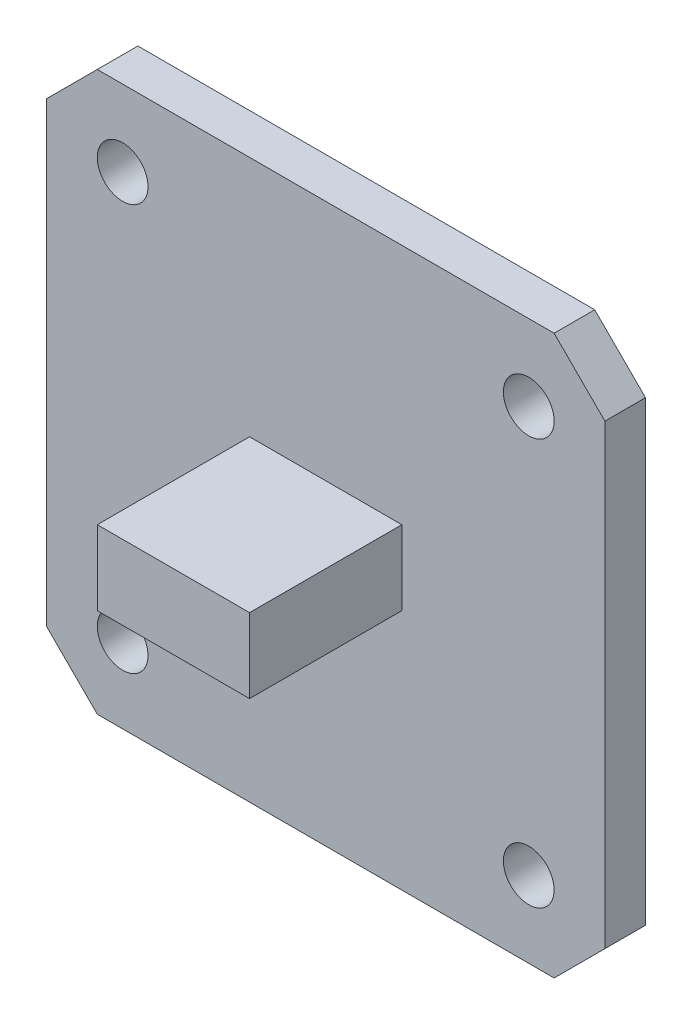
ISO-10303-21;
HEADER;
FILE_DESCRIPTION(('STEP AP214'),'2;1');
FILE_NAME('part.step','',(''),(''),'','','');
FILE_SCHEMA(('AUTOMOTIVE_DESIGN { 1 0 10303 214 1 1 1 1 }'));
ENDSEC;
DATA;
#1=APPLICATION_CONTEXT('core data for automotive mechanical design processes');
#2=APPLICATION_PROTOCOL_DEFINITION('international standard','automotive_design',2000,#1);
#3=PRODUCT_CONTEXT('',#1,'mechanical');
#4=PRODUCT('Part','Part','',(#3));
#5=PRODUCT_RELATED_PRODUCT_CATEGORY('part','',(#4));
#6=PRODUCT_DEFINITION_FORMATION('','',#4);
#7=PRODUCT_DEFINITION_CONTEXT('part definition',#1,'design');
#8=PRODUCT_DEFINITION('design','',#6,#7);
#9=PRODUCT_DEFINITION_SHAPE('','',#8);
#10=(LENGTH_UNIT() NAMED_UNIT(*) SI_UNIT(.MILLI.,.METRE.));
#11=(NAMED_UNIT(*) PLANE_ANGLE_UNIT() SI_UNIT($,.RADIAN.));
#12=(NAMED_UNIT(*) SI_UNIT($,.STERADIAN.) SOLID_ANGLE_UNIT());
#13=UNCERTAINTY_MEASURE_WITH_UNIT(LENGTH_MEASURE(1.E-05),#10,'distance_accuracy_value','');
#14=(GEOMETRIC_REPRESENTATION_CONTEXT(3) GLOBAL_UNCERTAINTY_ASSIGNED_CONTEXT((#13)) GLOBAL_UNIT_ASSIGNED_CONTEXT((#10,
#11,#12)) REPRESENTATION_CONTEXT('',''));
#15=CARTESIAN_POINT('',(0.,0.,0.));
#16=DIRECTION('',(0.,0.,1.));
#17=DIRECTION('',(1.,0.,0.));
#18=AXIS2_PLACEMENT_3D('',#15,#16,#17);
#19=CARTESIAN_POINT('',(0.,0.,2.4));
#20=DIRECTION('',(0.,0.,1.));
#21=DIRECTION('',(1.,0.,0.));
#22=AXIS2_PLACEMENT_3D('',#19,#20,#21);
#23=PLANE('',#22);
#24=CARTESIAN_POINT('',(4.49999999999999,4.5,2.4));
#25=DIRECTION('',(0.,0.,1.));
#26=DIRECTION('',(-1.,0.,0.));
#27=AXIS2_PLACEMENT_3D('',#24,#25,#26);
#28=CIRCLE('',#27,1.5);
#29=CARTESIAN_POINT('',(3.,4.5,2.4));
#30=VERTEX_POINT('',#29);
#31=EDGE_CURVE('E201',#30,#30,#28,.T.);
#32=ORIENTED_EDGE('',*,*,#31,.F.);
#33=EDGE_LOOP('',(#32));
#34=FACE_BOUND('',#33,.T.);
#35=CARTESIAN_POINT('',(4.5,28.5,2.4));
#36=DIRECTION('',(0.,0.,1.));
#37=DIRECTION('',(1.,0.,0.));
#38=AXIS2_PLACEMENT_3D('',#35,#36,#37);
#39=CIRCLE('',#38,1.5);
#40=CARTESIAN_POINT('',(6.,28.5,2.4));
#41=VERTEX_POINT('',#40);
#42=EDGE_CURVE('E146',#41,#41,#39,.T.);
#43=ORIENTED_EDGE('',*,*,#42,.F.);
#44=EDGE_LOOP('',(#43));
#45=FACE_BOUND('',#44,.T.);
#46=DIRECTION('',(-1.,0.,0.));
#47=VECTOR('',#46,1.);
#48=CARTESIAN_POINT('',(29.9999999999999,33.,2.4));
#49=LINE('',#48,#47);
#50=CARTESIAN_POINT('',(29.9999999999999,33.,2.4));
#51=VERTEX_POINT('',#50);
#52=CARTESIAN_POINT('',(3.,33.,2.4));
#53=VERTEX_POINT('',#52);
#54=EDGE_CURVE('E158',#51,#53,#49,.T.);
#55=ORIENTED_EDGE('',*,*,#54,.T.);
#56=DIRECTION('',(-0.707106781186547,-0.707106781186548,0.));
#57=VECTOR('',#56,1.);
#58=CARTESIAN_POINT('',(3.,33.,2.4));
#59=LINE('',#58,#57);
#60=CARTESIAN_POINT('',(0.,30.,2.4));
#61=VERTEX_POINT('',#60);
#62=EDGE_CURVE('E98',#53,#61,#59,.T.);
#63=ORIENTED_EDGE('',*,*,#62,.T.);
#64=DIRECTION('',(0.,-1.,0.));
#65=VECTOR('',#64,1.);
#66=CARTESIAN_POINT('',(0.,30.,2.4));
#67=LINE('',#66,#65);
#68=CARTESIAN_POINT('',(0.,3.00000000000001,2.4));
#69=VERTEX_POINT('',#68);
#70=EDGE_CURVE('E173',#61,#69,#67,.T.);
#71=ORIENTED_EDGE('',*,*,#70,.T.);
#72=DIRECTION('',(0.707106781186546,-0.707106781186549,0.));
#73=VECTOR('',#72,1.);
#74=CARTESIAN_POINT('',(0.,3.00000000000001,2.4));
#75=LINE('',#74,#73);
#76=CARTESIAN_POINT('',(3.,0.,2.4));
#77=VERTEX_POINT('',#76);
#78=EDGE_CURVE('E186',#69,#77,#75,.T.);
#79=ORIENTED_EDGE('',*,*,#78,.T.);
#80=DIRECTION('',(1.,0.,0.));
#81=VECTOR('',#80,1.);
#82=CARTESIAN_POINT('',(3.,0.,2.4));
#83=LINE('',#82,#81);
#84=CARTESIAN_POINT('',(30.,0.,2.4));
#85=VERTEX_POINT('',#84);
#86=EDGE_CURVE('E121',#77,#85,#83,.T.);
#87=ORIENTED_EDGE('',*,*,#86,.T.);
#88=DIRECTION('',(0.707106781186549,0.707106781186546,0.));
#89=VECTOR('',#88,1.);
#90=CARTESIAN_POINT('',(30.,0.,2.4));
#91=LINE('',#90,#89);
#92=CARTESIAN_POINT('',(33.,2.99999999999999,2.4));
#93=VERTEX_POINT('',#92);
#94=EDGE_CURVE('E114',#85,#93,#91,.T.);
#95=ORIENTED_EDGE('',*,*,#94,.T.);
#96=DIRECTION('',(0.,1.,0.));
#97=VECTOR('',#96,1.);
#98=CARTESIAN_POINT('',(33.,2.99999999999999,2.4));
#99=LINE('',#98,#97);
#100=CARTESIAN_POINT('',(33.,30.,2.4));
#101=VERTEX_POINT('',#100);
#102=EDGE_CURVE('E118',#93,#101,#99,.T.);
#103=ORIENTED_EDGE('',*,*,#102,.T.);
#104=DIRECTION('',(-0.707106781186561,0.707106781186534,0.));
#105=VECTOR('',#104,1.);
#106=CARTESIAN_POINT('',(33.,30.,2.4));
#107=LINE('',#106,#105);
#108=EDGE_CURVE('E57',#101,#51,#107,.T.);
#109=ORIENTED_EDGE('',*,*,#108,.T.);
#110=EDGE_LOOP('',(#55,#63,#71,#79,#87,#95,#103,#109));
#111=FACE_BOUND('',#110,.T.);
#112=CARTESIAN_POINT('',(28.4999999999999,28.5,2.4));
#113=DIRECTION('',(0.,0.,1.));
#114=DIRECTION('',(-1.,0.,0.));
#115=AXIS2_PLACEMENT_3D('',#112,#113,#114);
#116=CIRCLE('',#115,1.5);
#117=CARTESIAN_POINT('',(26.9999999999999,28.5,2.4));
#118=VERTEX_POINT('',#117);
#119=EDGE_CURVE('E195',#118,#118,#116,.T.);
#120=ORIENTED_EDGE('',*,*,#119,.F.);
#121=EDGE_LOOP('',(#120));
#122=FACE_BOUND('',#121,.T.);
#123=CARTESIAN_POINT('',(28.4999999999999,4.49999999999994,2.4));
#124=DIRECTION('',(0.,0.,1.));
#125=DIRECTION('',(1.,0.,0.));
#126=AXIS2_PLACEMENT_3D('',#123,#124,#125);
#127=CIRCLE('',#126,1.5);
#128=CARTESIAN_POINT('',(29.9999999999999,4.49999999999994,2.4));
#129=VERTEX_POINT('',#128);
#130=EDGE_CURVE('E207',#129,#129,#127,.T.);
#131=ORIENTED_EDGE('',*,*,#130,.F.);
#132=EDGE_LOOP('',(#131));
#133=FACE_BOUND('',#132,.T.);
#134=DIRECTION('',(1.,0.,0.));
#135=VECTOR('',#134,1.);
#136=CARTESIAN_POINT('',(11.9999999999999,14.3,2.4));
#137=LINE('',#136,#135);
#138=CARTESIAN_POINT('',(11.9999999999999,14.3,2.4));
#139=VERTEX_POINT('',#138);
#140=CARTESIAN_POINT('',(21.,14.3,2.4));
#141=VERTEX_POINT('',#140);
#142=EDGE_CURVE('E231',#139,#141,#137,.T.);
#143=ORIENTED_EDGE('',*,*,#142,.F.);
#144=DIRECTION('',(0.,-1.,0.));
#145=VECTOR('',#144,1.);
#146=CARTESIAN_POINT('',(11.9999999999999,18.7,2.4));
#147=LINE('',#146,#145);
#148=CARTESIAN_POINT('',(11.9999999999999,18.7,2.4));
#149=VERTEX_POINT('',#148);
#150=EDGE_CURVE('E234',#149,#139,#147,.T.);
#151=ORIENTED_EDGE('',*,*,#150,.F.);
#152=DIRECTION('',(-1.,0.,0.));
#153=VECTOR('',#152,1.);
#154=CARTESIAN_POINT('',(11.9999999999999,18.7,2.4));
#155=LINE('',#154,#153);
#156=CARTESIAN_POINT('',(21.,18.7,2.4));
#157=VERTEX_POINT('',#156);
#158=EDGE_CURVE('E226',#157,#149,#155,.T.);
#159=ORIENTED_EDGE('',*,*,#158,.F.);
#160=DIRECTION('',(0.,1.,0.));
#161=VECTOR('',#160,1.);
#162=CARTESIAN_POINT('',(21.,18.7,2.4));
#163=LINE('',#162,#161);
#164=EDGE_CURVE('E229',#141,#157,#163,.T.);
#165=ORIENTED_EDGE('',*,*,#164,.F.);
#166=EDGE_LOOP('',(#143,#151,#159,#165));
#167=FACE_BOUND('',#166,.T.);
#168=ADVANCED_FACE('F33',(#34,#45,#111,#122,#133,#167),#23,.T.);
#169=CARTESIAN_POINT('',(0.,0.,0.));
#170=DIRECTION('',(0.,0.,1.));
#171=DIRECTION('',(1.,0.,0.));
#172=AXIS2_PLACEMENT_3D('',#169,#170,#171);
#173=PLANE('',#172);
#174=DIRECTION('',(-1.,0.,0.));
#175=VECTOR('',#174,1.);
#176=CARTESIAN_POINT('',(29.9999999999999,33.,0.));
#177=LINE('',#176,#175);
#178=CARTESIAN_POINT('',(29.9999999999999,33.,0.));
#179=VERTEX_POINT('',#178);
#180=CARTESIAN_POINT('',(3.,33.,0.));
#181=VERTEX_POINT('',#180);
#182=EDGE_CURVE('E142',#179,#181,#177,.T.);
#183=ORIENTED_EDGE('',*,*,#182,.F.);
#184=DIRECTION('',(-0.707106781186561,0.707106781186534,0.));
#185=VECTOR('',#184,1.);
#186=CARTESIAN_POINT('',(33.,30.,0.));
#187=LINE('',#186,#185);
#188=CARTESIAN_POINT('',(33.,30.,0.));
#189=VERTEX_POINT('',#188);
#190=EDGE_CURVE('E90',#189,#179,#187,.T.);
#191=ORIENTED_EDGE('',*,*,#190,.F.);
#192=DIRECTION('',(0.,1.,0.));
#193=VECTOR('',#192,1.);
#194=CARTESIAN_POINT('',(33.,2.99999999999999,0.));
#195=LINE('',#194,#193);
#196=CARTESIAN_POINT('',(33.,2.99999999999999,0.));
#197=VERTEX_POINT('',#196);
#198=EDGE_CURVE('E155',#197,#189,#195,.T.);
#199=ORIENTED_EDGE('',*,*,#198,.F.);
#200=DIRECTION('',(0.707106781186549,0.707106781186546,0.));
#201=VECTOR('',#200,1.);
#202=CARTESIAN_POINT('',(30.,0.,0.));
#203=LINE('',#202,#201);
#204=CARTESIAN_POINT('',(30.,0.,0.));
#205=VERTEX_POINT('',#204);
#206=EDGE_CURVE('E130',#205,#197,#203,.T.);
#207=ORIENTED_EDGE('',*,*,#206,.F.);
#208=DIRECTION('',(1.,0.,0.));
#209=VECTOR('',#208,1.);
#210=CARTESIAN_POINT('',(3.,0.,0.));
#211=LINE('',#210,#209);
#212=CARTESIAN_POINT('',(3.,0.,0.));
#213=VERTEX_POINT('',#212);
#214=EDGE_CURVE('E152',#213,#205,#211,.T.);
#215=ORIENTED_EDGE('',*,*,#214,.F.);
#216=DIRECTION('',(0.707106781186546,-0.707106781186549,0.));
#217=VECTOR('',#216,1.);
#218=CARTESIAN_POINT('',(0.,3.00000000000001,0.));
#219=LINE('',#218,#217);
#220=CARTESIAN_POINT('',(0.,3.00000000000001,0.));
#221=VERTEX_POINT('',#220);
#222=EDGE_CURVE('E150',#221,#213,#219,.T.);
#223=ORIENTED_EDGE('',*,*,#222,.F.);
#224=DIRECTION('',(0.,-1.,0.));
#225=VECTOR('',#224,1.);
#226=CARTESIAN_POINT('',(0.,30.,0.));
#227=LINE('',#226,#225);
#228=CARTESIAN_POINT('',(0.,30.,0.));
#229=VERTEX_POINT('',#228);
#230=EDGE_CURVE('E148',#229,#221,#227,.T.);
#231=ORIENTED_EDGE('',*,*,#230,.F.);
#232=DIRECTION('',(-0.707106781186547,-0.707106781186548,0.));
#233=VECTOR('',#232,1.);
#234=CARTESIAN_POINT('',(3.,33.,0.));
#235=LINE('',#234,#233);
#236=EDGE_CURVE('E145',#181,#229,#235,.T.);
#237=ORIENTED_EDGE('',*,*,#236,.F.);
#238=EDGE_LOOP('',(#183,#191,#199,#207,#215,#223,#231,#237));
#239=FACE_BOUND('',#238,.T.);
#240=CARTESIAN_POINT('',(4.5,28.5,0.));
#241=DIRECTION('',(0.,0.,1.));
#242=DIRECTION('',(1.,0.,0.));
#243=AXIS2_PLACEMENT_3D('',#240,#241,#242);
#244=CIRCLE('',#243,1.5);
#245=CARTESIAN_POINT('',(6.,28.5,0.));
#246=VERTEX_POINT('',#245);
#247=EDGE_CURVE('E192',#246,#246,#244,.T.);
#248=ORIENTED_EDGE('',*,*,#247,.T.);
#249=EDGE_LOOP('',(#248));
#250=FACE_BOUND('',#249,.T.);
#251=CARTESIAN_POINT('',(28.4999999999999,28.5,0.));
#252=DIRECTION('',(0.,0.,1.));
#253=DIRECTION('',(-1.,0.,0.));
#254=AXIS2_PLACEMENT_3D('',#251,#252,#253);
#255=CIRCLE('',#254,1.5);
#256=CARTESIAN_POINT('',(26.9999999999999,28.5,0.));
#257=VERTEX_POINT('',#256);
#258=EDGE_CURVE('E198',#257,#257,#255,.T.);
#259=ORIENTED_EDGE('',*,*,#258,.T.);
#260=EDGE_LOOP('',(#259));
#261=FACE_BOUND('',#260,.T.);
#262=CARTESIAN_POINT('',(4.49999999999999,4.5,0.));
#263=DIRECTION('',(0.,0.,1.));
#264=DIRECTION('',(-1.,0.,0.));
#265=AXIS2_PLACEMENT_3D('',#262,#263,#264);
#266=CIRCLE('',#265,1.5);
#267=CARTESIAN_POINT('',(3.,4.5,0.));
#268=VERTEX_POINT('',#267);
#269=EDGE_CURVE('E204',#268,#268,#266,.T.);
#270=ORIENTED_EDGE('',*,*,#269,.T.);
#271=EDGE_LOOP('',(#270));
#272=FACE_BOUND('',#271,.T.);
#273=CARTESIAN_POINT('',(28.4999999999999,4.49999999999994,0.));
#274=DIRECTION('',(0.,0.,1.));
#275=DIRECTION('',(1.,0.,0.));
#276=AXIS2_PLACEMENT_3D('',#273,#274,#275);
#277=CIRCLE('',#276,1.5);
#278=CARTESIAN_POINT('',(29.9999999999999,4.49999999999994,0.));
#279=VERTEX_POINT('',#278);
#280=EDGE_CURVE('E210',#279,#279,#277,.T.);
#281=ORIENTED_EDGE('',*,*,#280,.T.);
#282=EDGE_LOOP('',(#281));
#283=FACE_BOUND('',#282,.T.);
#284=ADVANCED_FACE('F177',(#239,#250,#261,#272,#283),#173,.F.);
#285=CARTESIAN_POINT('',(29.9999999999999,33.,2.4));
#286=DIRECTION('',(0.,-1.,0.));
#287=DIRECTION('',(0.,0.,-1.));
#288=AXIS2_PLACEMENT_3D('',#285,#286,#287);
#289=PLANE('',#288);
#290=ORIENTED_EDGE('',*,*,#182,.T.);
#291=DIRECTION('',(0.,0.,-1.));
#292=VECTOR('',#291,1.);
#293=CARTESIAN_POINT('',(3.,33.,2.4));
#294=LINE('',#293,#292);
#295=EDGE_CURVE('E11',#53,#181,#294,.T.);
#296=ORIENTED_EDGE('',*,*,#295,.F.);
#297=ORIENTED_EDGE('',*,*,#54,.F.);
#298=DIRECTION('',(0.,0.,-1.));
#299=VECTOR('',#298,1.);
#300=CARTESIAN_POINT('',(29.9999999999999,33.,2.4));
#301=LINE('',#300,#299);
#302=EDGE_CURVE('E138',#51,#179,#301,.T.);
#303=ORIENTED_EDGE('',*,*,#302,.T.);
#304=EDGE_LOOP('',(#290,#296,#297,#303));
#305=FACE_BOUND('',#304,.T.);
#306=ADVANCED_FACE('F35',(#305),#289,.F.);
#307=CARTESIAN_POINT('',(3.,33.,2.4));
#308=DIRECTION('',(0.707106781186548,-0.707106781186547,0.));
#309=DIRECTION('',(0.707106781186547,0.707106781186548,0.));
#310=AXIS2_PLACEMENT_3D('',#307,#308,#309);
#311=PLANE('',#310);
#312=ORIENTED_EDGE('',*,*,#236,.T.);
#313=DIRECTION('',(0.,0.,-1.));
#314=VECTOR('',#313,1.);
#315=CARTESIAN_POINT('',(0.,30.,2.4));
#316=LINE('',#315,#314);
#317=EDGE_CURVE('E41',#61,#229,#316,.T.);
#318=ORIENTED_EDGE('',*,*,#317,.F.);
#319=ORIENTED_EDGE('',*,*,#62,.F.);
#320=ORIENTED_EDGE('',*,*,#295,.T.);
#321=EDGE_LOOP('',(#312,#318,#319,#320));
#322=FACE_BOUND('',#321,.T.);
#323=ADVANCED_FACE('F301',(#322),#311,.F.);
#324=CARTESIAN_POINT('',(0.,30.,2.4));
#325=DIRECTION('',(1.,0.,0.));
#326=DIRECTION('',(0.,1.,0.));
#327=AXIS2_PLACEMENT_3D('',#324,#325,#326);
#328=PLANE('',#327);
#329=ORIENTED_EDGE('',*,*,#230,.T.);
#330=DIRECTION('',(0.,0.,-1.));
#331=VECTOR('',#330,1.);
#332=CARTESIAN_POINT('',(0.,3.00000000000001,2.4));
#333=LINE('',#332,#331);
#334=EDGE_CURVE('E165',#69,#221,#333,.T.);
#335=ORIENTED_EDGE('',*,*,#334,.F.);
#336=ORIENTED_EDGE('',*,*,#70,.F.);
#337=ORIENTED_EDGE('',*,*,#317,.T.);
#338=EDGE_LOOP('',(#329,#335,#336,#337));
#339=FACE_BOUND('',#338,.T.);
#340=ADVANCED_FACE('F171',(#339),#328,.F.);
#341=CARTESIAN_POINT('',(0.,3.00000000000001,2.4));
#342=DIRECTION('',(0.707106781186549,0.707106781186546,0.));
#343=DIRECTION('',(-0.707106781186546,0.707106781186549,0.));
#344=AXIS2_PLACEMENT_3D('',#341,#342,#343);
#345=PLANE('',#344);
#346=ORIENTED_EDGE('',*,*,#222,.T.);
#347=DIRECTION('',(0.,0.,-1.));
#348=VECTOR('',#347,1.);
#349=CARTESIAN_POINT('',(3.,0.,2.4));
#350=LINE('',#349,#348);
#351=EDGE_CURVE('E162',#77,#213,#350,.T.);
#352=ORIENTED_EDGE('',*,*,#351,.F.);
#353=ORIENTED_EDGE('',*,*,#78,.F.);
#354=ORIENTED_EDGE('',*,*,#334,.T.);
#355=EDGE_LOOP('',(#346,#352,#353,#354));
#356=FACE_BOUND('',#355,.T.);
#357=ADVANCED_FACE('F182',(#356),#345,.F.);
#358=CARTESIAN_POINT('',(3.,0.,2.4));
#359=DIRECTION('',(0.,1.,0.));
#360=DIRECTION('',(0.,0.,1.));
#361=AXIS2_PLACEMENT_3D('',#358,#359,#360);
#362=PLANE('',#361);
#363=ORIENTED_EDGE('',*,*,#214,.T.);
#364=DIRECTION('',(0.,0.,-1.));
#365=VECTOR('',#364,1.);
#366=CARTESIAN_POINT('',(30.,0.,2.4));
#367=LINE('',#366,#365);
#368=EDGE_CURVE('E133',#85,#205,#367,.T.);
#369=ORIENTED_EDGE('',*,*,#368,.F.);
#370=ORIENTED_EDGE('',*,*,#86,.F.);
#371=ORIENTED_EDGE('',*,*,#351,.T.);
#372=EDGE_LOOP('',(#363,#369,#370,#371));
#373=FACE_BOUND('',#372,.T.);
#374=ADVANCED_FACE('F185',(#373),#362,.F.);
#375=CARTESIAN_POINT('',(30.,0.,2.4));
#376=DIRECTION('',(-0.707106781186546,0.707106781186549,0.));
#377=DIRECTION('',(-0.707106781186549,-0.707106781186546,0.));
#378=AXIS2_PLACEMENT_3D('',#375,#376,#377);
#379=PLANE('',#378);
#380=ORIENTED_EDGE('',*,*,#206,.T.);
#381=DIRECTION('',(0.,0.,-1.));
#382=VECTOR('',#381,1.);
#383=CARTESIAN_POINT('',(33.,2.99999999999999,2.4));
#384=LINE('',#383,#382);
#385=EDGE_CURVE('E127',#93,#197,#384,.T.);
#386=ORIENTED_EDGE('',*,*,#385,.F.);
#387=ORIENTED_EDGE('',*,*,#94,.F.);
#388=ORIENTED_EDGE('',*,*,#368,.T.);
#389=EDGE_LOOP('',(#380,#386,#387,#388));
#390=FACE_BOUND('',#389,.T.);
#391=ADVANCED_FACE('F128',(#390),#379,.F.);
#392=CARTESIAN_POINT('',(33.,2.99999999999999,2.4));
#393=DIRECTION('',(-1.,0.,0.));
#394=DIRECTION('',(0.,0.,1.));
#395=AXIS2_PLACEMENT_3D('',#392,#393,#394);
#396=PLANE('',#395);
#397=ORIENTED_EDGE('',*,*,#198,.T.);
#398=DIRECTION('',(0.,0.,-1.));
#399=VECTOR('',#398,1.);
#400=CARTESIAN_POINT('',(33.,30.,2.4));
#401=LINE('',#400,#399);
#402=EDGE_CURVE('E134',#101,#189,#401,.T.);
#403=ORIENTED_EDGE('',*,*,#402,.F.);
#404=ORIENTED_EDGE('',*,*,#102,.F.);
#405=ORIENTED_EDGE('',*,*,#385,.T.);
#406=EDGE_LOOP('',(#397,#403,#404,#405));
#407=FACE_BOUND('',#406,.T.);
#408=ADVANCED_FACE('F136',(#407),#396,.F.);
#409=CARTESIAN_POINT('',(33.,30.,2.4));
#410=DIRECTION('',(-0.707106781186534,-0.707106781186561,0.));
#411=DIRECTION('',(0.707106781186561,-0.707106781186534,0.));
#412=AXIS2_PLACEMENT_3D('',#409,#410,#411);
#413=PLANE('',#412);
#414=ORIENTED_EDGE('',*,*,#190,.T.);
#415=ORIENTED_EDGE('',*,*,#302,.F.);
#416=ORIENTED_EDGE('',*,*,#108,.F.);
#417=ORIENTED_EDGE('',*,*,#402,.T.);
#418=EDGE_LOOP('',(#414,#415,#416,#417));
#419=FACE_BOUND('',#418,.T.);
#420=ADVANCED_FACE('F289',(#419),#413,.F.);
#421=CARTESIAN_POINT('',(4.5,28.5,2.4));
#422=DIRECTION('',(0.,0.,-1.));
#423=DIRECTION('',(-1.,0.,0.));
#424=AXIS2_PLACEMENT_3D('',#421,#422,#423);
#425=CYLINDRICAL_SURFACE('',#424,1.5);
#426=ORIENTED_EDGE('',*,*,#42,.T.);
#427=EDGE_LOOP('',(#426));
#428=FACE_BOUND('',#427,.T.);
#429=ORIENTED_EDGE('',*,*,#247,.F.);
#430=EDGE_LOOP('',(#429));
#431=FACE_BOUND('',#430,.T.);
#432=ADVANCED_FACE('F286',(#428,#431),#425,.F.);
#433=CARTESIAN_POINT('',(28.4999999999999,28.5,2.4));
#434=DIRECTION('',(0.,0.,-1.));
#435=DIRECTION('',(-1.,0.,0.));
#436=AXIS2_PLACEMENT_3D('',#433,#434,#435);
#437=CYLINDRICAL_SURFACE('',#436,1.5);
#438=ORIENTED_EDGE('',*,*,#119,.T.);
#439=EDGE_LOOP('',(#438));
#440=FACE_BOUND('',#439,.T.);
#441=ORIENTED_EDGE('',*,*,#258,.F.);
#442=EDGE_LOOP('',(#441));
#443=FACE_BOUND('',#442,.T.);
#444=ADVANCED_FACE('F361',(#440,#443),#437,.F.);
#445=CARTESIAN_POINT('',(4.49999999999999,4.5,2.4));
#446=DIRECTION('',(0.,0.,-1.));
#447=DIRECTION('',(-1.,0.,0.));
#448=AXIS2_PLACEMENT_3D('',#445,#446,#447);
#449=CYLINDRICAL_SURFACE('',#448,1.5);
#450=ORIENTED_EDGE('',*,*,#31,.T.);
#451=EDGE_LOOP('',(#450));
#452=FACE_BOUND('',#451,.T.);
#453=ORIENTED_EDGE('',*,*,#269,.F.);
#454=EDGE_LOOP('',(#453));
#455=FACE_BOUND('',#454,.T.);
#456=ADVANCED_FACE('F369',(#452,#455),#449,.F.);
#457=CARTESIAN_POINT('',(28.4999999999999,4.49999999999994,2.4));
#458=DIRECTION('',(0.,0.,-1.));
#459=DIRECTION('',(-1.,0.,0.));
#460=AXIS2_PLACEMENT_3D('',#457,#458,#459);
#461=CYLINDRICAL_SURFACE('',#460,1.5);
#462=ORIENTED_EDGE('',*,*,#130,.T.);
#463=EDGE_LOOP('',(#462));
#464=FACE_BOUND('',#463,.T.);
#465=ORIENTED_EDGE('',*,*,#280,.F.);
#466=EDGE_LOOP('',(#465));
#467=FACE_BOUND('',#466,.T.);
#468=ADVANCED_FACE('F377',(#464,#467),#461,.F.);
#469=CARTESIAN_POINT('',(11.9999999999999,18.7,11.4));
#470=DIRECTION('',(1.,0.,0.));
#471=DIRECTION('',(0.,0.,-1.));
#472=AXIS2_PLACEMENT_3D('',#469,#470,#471);
#473=PLANE('',#472);
#474=ORIENTED_EDGE('',*,*,#150,.T.);
#475=DIRECTION('',(0.,0.,-1.));
#476=VECTOR('',#475,1.);
#477=CARTESIAN_POINT('',(11.9999999999999,14.3,11.4));
#478=LINE('',#477,#476);
#479=CARTESIAN_POINT('',(11.9999999999999,14.3,11.4));
#480=VERTEX_POINT('',#479);
#481=EDGE_CURVE('E213',#480,#139,#478,.T.);
#482=ORIENTED_EDGE('',*,*,#481,.F.);
#483=DIRECTION('',(0.,-1.,0.));
#484=VECTOR('',#483,1.);
#485=CARTESIAN_POINT('',(11.9999999999999,18.7,11.4));
#486=LINE('',#485,#484);
#487=CARTESIAN_POINT('',(11.9999999999999,18.7,11.4));
#488=VERTEX_POINT('',#487);
#489=EDGE_CURVE('E228',#488,#480,#486,.T.);
#490=ORIENTED_EDGE('',*,*,#489,.F.);
#491=DIRECTION('',(0.,0.,-1.));
#492=VECTOR('',#491,1.);
#493=CARTESIAN_POINT('',(11.9999999999999,18.7,11.4));
#494=LINE('',#493,#492);
#495=EDGE_CURVE('E222',#488,#149,#494,.T.);
#496=ORIENTED_EDGE('',*,*,#495,.T.);
#497=EDGE_LOOP('',(#474,#482,#490,#496));
#498=FACE_BOUND('',#497,.T.);
#499=ADVANCED_FACE('F257',(#498),#473,.F.);
#500=CARTESIAN_POINT('',(11.9999999999999,14.3,11.4));
#501=DIRECTION('',(0.,1.,0.));
#502=DIRECTION('',(-1.,0.,0.));
#503=AXIS2_PLACEMENT_3D('',#500,#501,#502);
#504=PLANE('',#503);
#505=ORIENTED_EDGE('',*,*,#142,.T.);
#506=DIRECTION('',(0.,0.,-1.));
#507=VECTOR('',#506,1.);
#508=CARTESIAN_POINT('',(21.,14.3,11.4));
#509=LINE('',#508,#507);
#510=CARTESIAN_POINT('',(21.,14.3,11.4));
#511=VERTEX_POINT('',#510);
#512=EDGE_CURVE('E218',#511,#141,#509,.T.);
#513=ORIENTED_EDGE('',*,*,#512,.F.);
#514=DIRECTION('',(1.,0.,0.));
#515=VECTOR('',#514,1.);
#516=CARTESIAN_POINT('',(11.9999999999999,14.3,11.4));
#517=LINE('',#516,#515);
#518=EDGE_CURVE('E242',#480,#511,#517,.T.);
#519=ORIENTED_EDGE('',*,*,#518,.F.);
#520=ORIENTED_EDGE('',*,*,#481,.T.);
#521=EDGE_LOOP('',(#505,#513,#519,#520));
#522=FACE_BOUND('',#521,.T.);
#523=ADVANCED_FACE('F262',(#522),#504,.F.);
#524=CARTESIAN_POINT('',(21.,18.7,11.4));
#525=DIRECTION('',(-1.,0.,0.));
#526=DIRECTION('',(0.,0.,1.));
#527=AXIS2_PLACEMENT_3D('',#524,#525,#526);
#528=PLANE('',#527);
#529=ORIENTED_EDGE('',*,*,#164,.T.);
#530=DIRECTION('',(0.,0.,-1.));
#531=VECTOR('',#530,1.);
#532=CARTESIAN_POINT('',(21.,18.7,11.4));
#533=LINE('',#532,#531);
#534=CARTESIAN_POINT('',(21.,18.7,11.4));
#535=VERTEX_POINT('',#534);
#536=EDGE_CURVE('E48',#535,#157,#533,.T.);
#537=ORIENTED_EDGE('',*,*,#536,.F.);
#538=DIRECTION('',(0.,1.,0.));
#539=VECTOR('',#538,1.);
#540=CARTESIAN_POINT('',(21.,18.7,11.4));
#541=LINE('',#540,#539);
#542=EDGE_CURVE('E239',#511,#535,#541,.T.);
#543=ORIENTED_EDGE('',*,*,#542,.F.);
#544=ORIENTED_EDGE('',*,*,#512,.T.);
#545=EDGE_LOOP('',(#529,#537,#543,#544));
#546=FACE_BOUND('',#545,.T.);
#547=ADVANCED_FACE('F271',(#546),#528,.F.);
#548=CARTESIAN_POINT('',(11.9999999999999,18.7,11.4));
#549=DIRECTION('',(0.,-1.,0.));
#550=DIRECTION('',(0.,0.,-1.));
#551=AXIS2_PLACEMENT_3D('',#548,#549,#550);
#552=PLANE('',#551);
#553=ORIENTED_EDGE('',*,*,#158,.T.);
#554=ORIENTED_EDGE('',*,*,#495,.F.);
#555=DIRECTION('',(-1.,0.,0.));
#556=VECTOR('',#555,1.);
#557=CARTESIAN_POINT('',(11.9999999999999,18.7,11.4));
#558=LINE('',#557,#556);
#559=EDGE_CURVE('E225',#535,#488,#558,.T.);
#560=ORIENTED_EDGE('',*,*,#559,.F.);
#561=ORIENTED_EDGE('',*,*,#536,.T.);
#562=EDGE_LOOP('',(#553,#554,#560,#561));
#563=FACE_BOUND('',#562,.T.);
#564=ADVANCED_FACE('F274',(#563),#552,.F.);
#565=CARTESIAN_POINT('',(0.,0.,11.4));
#566=DIRECTION('',(0.,0.,1.));
#567=DIRECTION('',(1.,0.,0.));
#568=AXIS2_PLACEMENT_3D('',#565,#566,#567);
#569=PLANE('',#568);
#570=ORIENTED_EDGE('',*,*,#489,.T.);
#571=ORIENTED_EDGE('',*,*,#518,.T.);
#572=ORIENTED_EDGE('',*,*,#542,.T.);
#573=ORIENTED_EDGE('',*,*,#559,.T.);
#574=EDGE_LOOP('',(#570,#571,#572,#573));
#575=FACE_BOUND('',#574,.T.);
#576=ADVANCED_FACE('F250',(#575),#569,.T.);
#577=CLOSED_SHELL('',(#168,#284,#306,#323,#340,#357,#374,#391,#408,#420,#432,#444,#456,#468,
#499,#523,#547,#564,#576));
#578=MANIFOLD_SOLID_BREP('B2',#577);
#579=ADVANCED_BREP_SHAPE_REPRESENTATION('',(#18,#578),#14);
#580=SHAPE_DEFINITION_REPRESENTATION(#9,#579);
ENDSEC;
END-ISO-10303-21;
